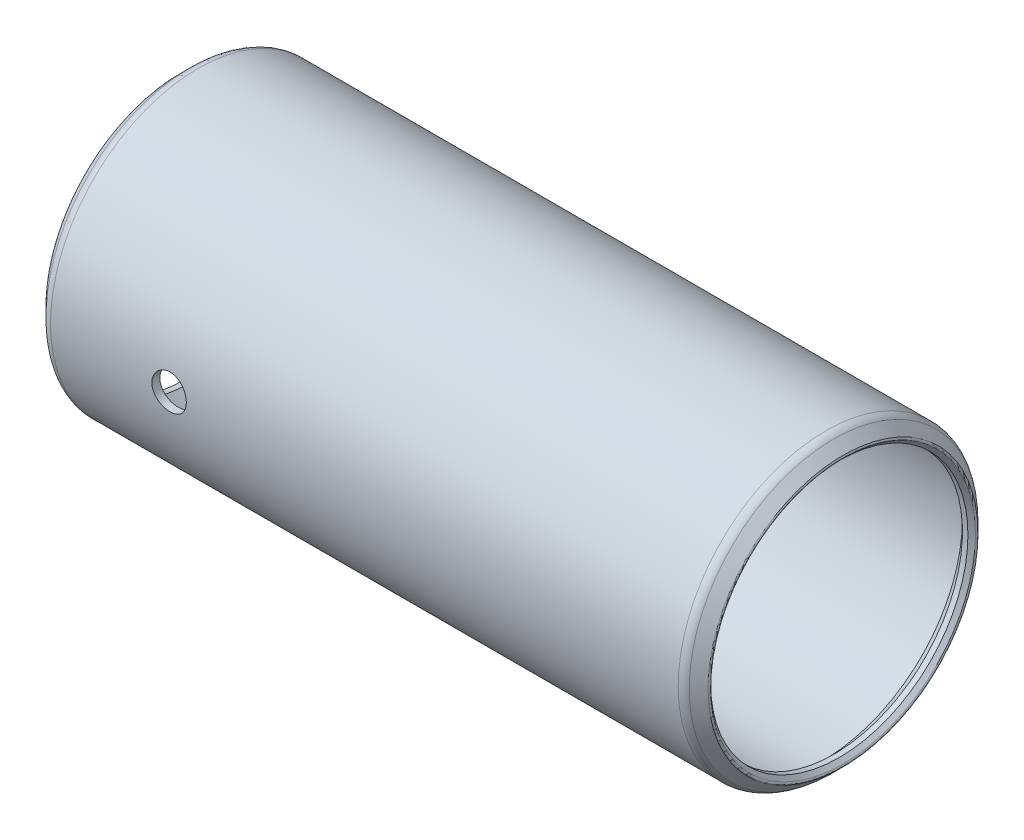
ISO-10303-21;
HEADER;
FILE_DESCRIPTION(('STEP AP214'),'2;1');
FILE_NAME('part.step','',(''),(''),'','','');
FILE_SCHEMA(('AUTOMOTIVE_DESIGN { 1 0 10303 214 1 1 1 1 }'));
ENDSEC;
DATA;
#1=APPLICATION_CONTEXT('core data for automotive mechanical design processes');
#2=APPLICATION_PROTOCOL_DEFINITION('international standard','automotive_design',2000,#1);
#3=PRODUCT_CONTEXT('',#1,'mechanical');
#4=PRODUCT('Part','Part','',(#3));
#5=PRODUCT_RELATED_PRODUCT_CATEGORY('part','',(#4));
#6=PRODUCT_DEFINITION_FORMATION('','',#4);
#7=PRODUCT_DEFINITION_CONTEXT('part definition',#1,'design');
#8=PRODUCT_DEFINITION('design','',#6,#7);
#9=PRODUCT_DEFINITION_SHAPE('','',#8);
#10=(LENGTH_UNIT() NAMED_UNIT(*) SI_UNIT(.MILLI.,.METRE.));
#11=(NAMED_UNIT(*) PLANE_ANGLE_UNIT() SI_UNIT($,.RADIAN.));
#12=(NAMED_UNIT(*) SI_UNIT($,.STERADIAN.) SOLID_ANGLE_UNIT());
#13=UNCERTAINTY_MEASURE_WITH_UNIT(LENGTH_MEASURE(1.E-05),#10,'distance_accuracy_value','');
#14=(GEOMETRIC_REPRESENTATION_CONTEXT(3) GLOBAL_UNCERTAINTY_ASSIGNED_CONTEXT((#13)) GLOBAL_UNIT_ASSIGNED_CONTEXT((#10,
#11,#12)) REPRESENTATION_CONTEXT('',''));
#15=CARTESIAN_POINT('',(0.,0.,0.));
#16=DIRECTION('',(0.,0.,1.));
#17=DIRECTION('',(1.,0.,0.));
#18=AXIS2_PLACEMENT_3D('',#15,#16,#17);
#19=CARTESIAN_POINT('',(-0.639512806053456,0.,0.));
#20=DIRECTION('',(-1.,0.,0.));
#21=DIRECTION('',(0.,0.,1.));
#22=AXIS2_PLACEMENT_3D('',#19,#20,#21);
#23=CONICAL_SURFACE('',#22,9.16756280605346,0.785398163397452);
#24=CARTESIAN_POINT('',(-0.639512806053464,0.,0.));
#25=DIRECTION('',(1.,0.,0.));
#26=DIRECTION('',(0.,0.,-1.));
#27=AXIS2_PLACEMENT_3D('',#24,#25,#26);
#28=CIRCLE('',#27,9.16756280605346);
#29=CARTESIAN_POINT('',(-0.639512806053464,0.,-9.16756280605346));
#30=VERTEX_POINT('',#29);
#31=EDGE_CURVE('E136',#30,#30,#28,.T.);
#32=ORIENTED_EDGE('',*,*,#31,.F.);
#33=EDGE_LOOP('',(#32));
#34=FACE_BOUND('',#33,.T.);
#35=CARTESIAN_POINT('',(-0.380999999999999,0.,0.));
#36=DIRECTION('',(-1.,0.,0.));
#37=DIRECTION('',(0.,0.,1.));
#38=AXIS2_PLACEMENT_3D('',#35,#36,#37);
#39=CIRCLE('',#38,8.90905);
#40=CARTESIAN_POINT('',(-0.380999999999999,0.,8.90905));
#41=VERTEX_POINT('',#40);
#42=EDGE_CURVE('E139',#41,#41,#39,.F.);
#43=ORIENTED_EDGE('',*,*,#42,.T.);
#44=EDGE_LOOP('',(#43));
#45=FACE_BOUND('',#44,.T.);
#46=ADVANCED_FACE('F15',(#34,#45),#23,.F.);
#47=CARTESIAN_POINT('',(45.2165128060534,0.,0.));
#48=DIRECTION('',(1.,0.,0.));
#49=DIRECTION('',(0.,0.,-1.));
#50=AXIS2_PLACEMENT_3D('',#47,#48,#49);
#51=CONICAL_SURFACE('',#50,9.16756280605341,0.785398163397432);
#52=CARTESIAN_POINT('',(44.958,0.,0.));
#53=DIRECTION('',(-1.,0.,0.));
#54=DIRECTION('',(0.,0.,1.));
#55=AXIS2_PLACEMENT_3D('',#52,#53,#54);
#56=CIRCLE('',#55,8.90905);
#57=CARTESIAN_POINT('',(44.958,0.,8.90905));
#58=VERTEX_POINT('',#57);
#59=EDGE_CURVE('E144',#58,#58,#56,.T.);
#60=ORIENTED_EDGE('',*,*,#59,.T.);
#61=EDGE_LOOP('',(#60));
#62=FACE_BOUND('',#61,.T.);
#63=CARTESIAN_POINT('',(45.2165128060534,0.,0.));
#64=DIRECTION('',(1.,0.,0.));
#65=DIRECTION('',(0.,0.,-1.));
#66=AXIS2_PLACEMENT_3D('',#63,#64,#65);
#67=CIRCLE('',#66,9.16756280605341);
#68=CARTESIAN_POINT('',(45.2165128060534,0.,-9.16756280605341));
#69=VERTEX_POINT('',#68);
#70=EDGE_CURVE('E112',#69,#69,#67,.F.);
#71=ORIENTED_EDGE('',*,*,#70,.F.);
#72=EDGE_LOOP('',(#71));
#73=FACE_BOUND('',#72,.T.);
#74=ADVANCED_FACE('F149',(#62,#73),#51,.F.);
#75=CARTESIAN_POINT('',(44.577,0.,0.));
#76=DIRECTION('',(-1.,0.,0.));
#77=DIRECTION('',(0.,0.,1.));
#78=AXIS2_PLACEMENT_3D('',#75,#76,#77);
#79=CYLINDRICAL_SURFACE('',#78,8.90905);
#80=CARTESIAN_POINT('',(44.577,0.,0.));
#81=DIRECTION('',(-1.,0.,0.));
#82=DIRECTION('',(0.,0.,1.));
#83=AXIS2_PLACEMENT_3D('',#80,#81,#82);
#84=CIRCLE('',#83,8.90905);
#85=CARTESIAN_POINT('',(44.577,0.,8.90905));
#86=VERTEX_POINT('',#85);
#87=EDGE_CURVE('E107',#86,#86,#84,.T.);
#88=ORIENTED_EDGE('',*,*,#87,.T.);
#89=EDGE_LOOP('',(#88));
#90=FACE_BOUND('',#89,.T.);
#91=ORIENTED_EDGE('',*,*,#59,.F.);
#92=EDGE_LOOP('',(#91));
#93=FACE_BOUND('',#92,.T.);
#94=ADVANCED_FACE('F152',(#90,#93),#79,.F.);
#95=CARTESIAN_POINT('',(44.577,0.,0.));
#96=DIRECTION('',(-1.,0.,0.));
#97=DIRECTION('',(0.,0.,1.));
#98=AXIS2_PLACEMENT_3D('',#95,#96,#97);
#99=CYLINDRICAL_SURFACE('',#98,8.90905);
#100=ORIENTED_EDGE('',*,*,#42,.F.);
#101=EDGE_LOOP('',(#100));
#102=FACE_BOUND('',#101,.T.);
#103=CARTESIAN_POINT('',(0.,0.,0.));
#104=DIRECTION('',(1.,0.,0.));
#105=DIRECTION('',(0.,0.,-1.));
#106=AXIS2_PLACEMENT_3D('',#103,#104,#105);
#107=CIRCLE('',#106,8.90905);
#108=CARTESIAN_POINT('',(0.,0.,-8.90905));
#109=VERTEX_POINT('',#108);
#110=EDGE_CURVE('E102',#109,#109,#107,.T.);
#111=ORIENTED_EDGE('',*,*,#110,.T.);
#112=EDGE_LOOP('',(#111));
#113=FACE_BOUND('',#112,.T.);
#114=ADVANCED_FACE('F130',(#102,#113),#99,.F.);
#115=CARTESIAN_POINT('',(-0.549710244842767,0.,0.));
#116=DIRECTION('',(1.,0.,0.));
#117=DIRECTION('',(0.,0.,-1.));
#118=AXIS2_PLACEMENT_3D('',#115,#116,#117);
#119=TOROIDAL_SURFACE('',#118,9.25736536726414,0.126999999999999);
#120=CARTESIAN_POINT('',(-0.639512806053453,0.,0.));
#121=DIRECTION('',(1.,0.,0.));
#122=DIRECTION('',(0.,0.,-1.));
#123=AXIS2_PLACEMENT_3D('',#120,#121,#122);
#124=CIRCLE('',#123,9.34716792847483);
#125=CARTESIAN_POINT('',(-0.639512806053452,0.,-9.34716792847483));
#126=VERTEX_POINT('',#125);
#127=EDGE_CURVE('E97',#126,#126,#124,.T.);
#128=ORIENTED_EDGE('',*,*,#127,.F.);
#129=EDGE_LOOP('',(#128));
#130=FACE_BOUND('',#129,.T.);
#131=ORIENTED_EDGE('',*,*,#31,.T.);
#132=EDGE_LOOP('',(#131));
#133=FACE_BOUND('',#132,.T.);
#134=ADVANCED_FACE('F124',(#130,#133),#119,.T.);
#135=CARTESIAN_POINT('',(45.1267102448427,0.,0.));
#136=DIRECTION('',(1.,0.,0.));
#137=DIRECTION('',(0.,0.,-1.));
#138=AXIS2_PLACEMENT_3D('',#135,#136,#137);
#139=TOROIDAL_SURFACE('',#138,9.25736536726414,0.12700000000001);
#140=ORIENTED_EDGE('',*,*,#70,.T.);
#141=EDGE_LOOP('',(#140));
#142=FACE_BOUND('',#141,.T.);
#143=CARTESIAN_POINT('',(45.2165128060534,0.,0.));
#144=DIRECTION('',(-1.,0.,0.));
#145=DIRECTION('',(0.,0.,1.));
#146=AXIS2_PLACEMENT_3D('',#143,#144,#145);
#147=CIRCLE('',#146,9.34716792847484);
#148=CARTESIAN_POINT('',(45.2165128060534,0.,9.34716792847484));
#149=VERTEX_POINT('',#148);
#150=EDGE_CURVE('E92',#149,#149,#147,.T.);
#151=ORIENTED_EDGE('',*,*,#150,.F.);
#152=EDGE_LOOP('',(#151));
#153=FACE_BOUND('',#152,.T.);
#154=ADVANCED_FACE('F119',(#142,#153),#139,.T.);
#155=CARTESIAN_POINT('',(43.815,0.,0.));
#156=DIRECTION('',(-1.,0.,0.));
#157=DIRECTION('',(0.,0.,1.));
#158=AXIS2_PLACEMENT_3D('',#155,#156,#157);
#159=CONICAL_SURFACE('',#158,9.67105,0.78539816339745);
#160=CARTESIAN_POINT('',(43.815,0.,0.));
#161=DIRECTION('',(-1.,0.,0.));
#162=DIRECTION('',(0.,0.,1.));
#163=AXIS2_PLACEMENT_3D('',#160,#161,#162);
#164=CIRCLE('',#163,9.67105);
#165=CARTESIAN_POINT('',(43.815,0.,9.67105));
#166=VERTEX_POINT('',#165);
#167=EDGE_CURVE('E87',#166,#166,#164,.T.);
#168=ORIENTED_EDGE('',*,*,#167,.T.);
#169=EDGE_LOOP('',(#168));
#170=FACE_BOUND('',#169,.T.);
#171=ORIENTED_EDGE('',*,*,#87,.F.);
#172=EDGE_LOOP('',(#171));
#173=FACE_BOUND('',#172,.T.);
#174=ADVANCED_FACE('F123',(#170,#173),#159,.F.);
#175=CARTESIAN_POINT('',(0.762,0.,0.));
#176=DIRECTION('',(1.,0.,0.));
#177=DIRECTION('',(0.,0.,-1.));
#178=AXIS2_PLACEMENT_3D('',#175,#176,#177);
#179=CONICAL_SURFACE('',#178,9.67105,0.785398163397448);
#180=ORIENTED_EDGE('',*,*,#110,.F.);
#181=EDGE_LOOP('',(#180));
#182=FACE_BOUND('',#181,.T.);
#183=CARTESIAN_POINT('',(0.761999999999999,0.,0.));
#184=DIRECTION('',(-1.,0.,0.));
#185=DIRECTION('',(0.,0.,1.));
#186=AXIS2_PLACEMENT_3D('',#183,#184,#185);
#187=CIRCLE('',#186,9.67105);
#188=CARTESIAN_POINT('',(0.761999999999999,0.,9.67105));
#189=VERTEX_POINT('',#188);
#190=EDGE_CURVE('E82',#189,#189,#187,.F.);
#191=ORIENTED_EDGE('',*,*,#190,.T.);
#192=EDGE_LOOP('',(#191));
#193=FACE_BOUND('',#192,.T.);
#194=ADVANCED_FACE('F163',(#182,#193),#179,.F.);
#195=CARTESIAN_POINT('',(0.013634632735857,0.,0.));
#196=DIRECTION('',(1.,0.,0.));
#197=DIRECTION('',(0.,1.,0.));
#198=AXIS2_PLACEMENT_3D('',#195,#196,#197);
#199=CONICAL_SURFACE('',#198,10.0003153672641,0.785398163397447);
#200=CARTESIAN_POINT('',(0.0136346327358494,0.,0.));
#201=DIRECTION('',(1.,0.,0.));
#202=DIRECTION('',(0.,0.,-1.));
#203=AXIS2_PLACEMENT_3D('',#200,#201,#202);
#204=CIRCLE('',#203,10.0003153672641);
#205=CARTESIAN_POINT('',(0.0136346327358494,0.,-10.0003153672641));
#206=VERTEX_POINT('',#205);
#207=EDGE_CURVE('E79',#206,#206,#204,.T.);
#208=ORIENTED_EDGE('',*,*,#207,.F.);
#209=EDGE_LOOP('',(#208));
#210=FACE_BOUND('',#209,.T.);
#211=ORIENTED_EDGE('',*,*,#127,.T.);
#212=EDGE_LOOP('',(#211));
#213=FACE_BOUND('',#212,.T.);
#214=ADVANCED_FACE('F168',(#210,#213),#199,.T.);
#215=CARTESIAN_POINT('',(44.5633653672641,0.,0.));
#216=DIRECTION('',(-1.,0.,0.));
#217=DIRECTION('',(0.,-1.,0.));
#218=AXIS2_PLACEMENT_3D('',#215,#216,#217);
#219=CONICAL_SURFACE('',#218,10.0003153672641,0.785398163397447);
#220=ORIENTED_EDGE('',*,*,#150,.T.);
#221=EDGE_LOOP('',(#220));
#222=FACE_BOUND('',#221,.T.);
#223=CARTESIAN_POINT('',(44.5633653672642,0.,0.));
#224=DIRECTION('',(1.,0.,0.));
#225=DIRECTION('',(0.,0.,-1.));
#226=AXIS2_PLACEMENT_3D('',#223,#224,#225);
#227=CIRCLE('',#226,10.0003153672641);
#228=CARTESIAN_POINT('',(44.5633653672642,0.,-10.0003153672641));
#229=VERTEX_POINT('',#228);
#230=EDGE_CURVE('E58',#229,#229,#227,.F.);
#231=ORIENTED_EDGE('',*,*,#230,.F.);
#232=EDGE_LOOP('',(#231));
#233=FACE_BOUND('',#232,.T.);
#234=ADVANCED_FACE('F173',(#222,#233),#219,.T.);
#235=CARTESIAN_POINT('',(44.577,0.,0.));
#236=DIRECTION('',(-1.,0.,0.));
#237=DIRECTION('',(0.,0.,1.));
#238=AXIS2_PLACEMENT_3D('',#235,#236,#237);
#239=CYLINDRICAL_SURFACE('',#238,9.67105);
#240=CARTESIAN_POINT('',(7.57499932623616,-0.117541672472774,9.67033701722398));
#241=CARTESIAN_POINT('',(7.58158854313117,-0.184113116031582,9.66952724776607));
#242=CARTESIAN_POINT('',(7.5937914631775,-0.250163463955482,9.66802944918942));
#243=CARTESIAN_POINT('',(7.62907848047445,-0.379301163106916,9.66382526538221));
#244=CARTESIAN_POINT('',(7.65217434105466,-0.442385229848643,9.66111757375003));
#245=CARTESIAN_POINT('',(7.70855830436448,-0.563721646811677,9.65479766108064));
#246=CARTESIAN_POINT('',(7.74183924989512,-0.621977353571383,9.65118607554576));
#247=CARTESIAN_POINT('',(7.81764381178295,-0.732070242021515,9.64346052700254));
#248=CARTESIAN_POINT('',(7.86016572248835,-0.783908605425708,9.63934665676475));
#249=CARTESIAN_POINT('',(7.95349690235225,-0.879982789610553,9.63105287043349));
#250=CARTESIAN_POINT('',(8.00434522391299,-0.924180663854123,9.62687273125568));
#251=CARTESIAN_POINT('',(8.11276559274869,-1.00342537190042,9.61893635505544));
#252=CARTESIAN_POINT('',(8.17033787267402,-1.03847188892841,9.61518013270946));
#253=CARTESIAN_POINT('',(8.29063690036858,-1.09843125062155,9.60851559389446));
#254=CARTESIAN_POINT('',(8.35336729530751,-1.12333684954758,9.60560788411092));
#255=CARTESIAN_POINT('',(8.48216397569071,-1.16224550388362,9.6009781145109));
#256=CARTESIAN_POINT('',(8.54823010522747,-1.17624906833798,9.59925599933635));
#257=CARTESIAN_POINT('',(8.68136457128116,-1.19288111653293,9.59720342851375));
#258=CARTESIAN_POINT('',(8.74842363721524,-1.1955827356608,9.59686402564868));
#259=CARTESIAN_POINT('',(8.88203976845853,-1.18973090344071,9.597591196177));
#260=CARTESIAN_POINT('',(8.94859684610853,-1.18117772969178,9.5986577348929));
#261=CARTESIAN_POINT('',(9.07907693648965,-1.15312242880594,9.60206816808755));
#262=CARTESIAN_POINT('',(9.14300847934612,-1.1336593698528,9.60440750382083));
#263=CARTESIAN_POINT('',(9.26669947110793,-1.08437895676159,9.61009583082664));
#264=CARTESIAN_POINT('',(9.32645877786876,-1.0545612500561,9.61344485647779));
#265=CARTESIAN_POINT('',(9.44043411658948,-0.985247244076201,9.62079580179556));
#266=CARTESIAN_POINT('',(9.49462132205795,-0.945703884124577,9.62480086345104));
#267=CARTESIAN_POINT('',(9.59561637584779,-0.858123764093473,9.6330037421642));
#268=CARTESIAN_POINT('',(9.64242394112626,-0.810086678390663,9.63720156660724));
#269=CARTESIAN_POINT('',(9.72760454269094,-0.706551991202835,9.64534597211571));
#270=CARTESIAN_POINT('',(9.76592768220346,-0.651013194979445,9.64929097472557));
#271=CARTESIAN_POINT('',(9.83270259713376,-0.534245209413172,9.65645933254044));
#272=CARTESIAN_POINT('',(9.86115453608433,-0.473016114360821,9.65968269970022));
#273=CARTESIAN_POINT('',(9.90730432415686,-0.346747294087756,9.66503774853834));
#274=CARTESIAN_POINT('',(9.92502721622616,-0.281716834189445,9.66717197057436));
#275=CARTESIAN_POINT('',(9.94929591821741,-0.14957450154383,9.670118951223));
#276=CARTESIAN_POINT('',(9.95584224402957,-0.0824627250119578,9.67093177082909));
#277=CARTESIAN_POINT('',(9.95755646929689,0.0514572027889127,9.67114338317607));
#278=CARTESIAN_POINT('',(9.95280022714426,0.118264380085298,9.67055160306997));
#279=CARTESIAN_POINT('',(9.9322091218143,0.250122171686788,9.66803996298382));
#280=CARTESIAN_POINT('',(9.91637429982445,0.315172792521412,9.66612010794125));
#281=CARTESIAN_POINT('',(9.87410571006115,0.441638971645314,9.66116807123172));
#282=CARTESIAN_POINT('',(9.84767891971315,0.503056892459059,9.65813662193561));
#283=CARTESIAN_POINT('',(9.78498464984786,0.620598911033191,9.65129708407713));
#284=CARTESIAN_POINT('',(9.74871675411091,0.67672278475185,9.64748896266789));
#285=CARTESIAN_POINT('',(9.66709630558121,0.782468956808014,9.63949089541932));
#286=CARTESIAN_POINT('',(9.62168725400926,0.832047478107128,9.63529866797039));
#287=CARTESIAN_POINT('',(9.52319822638314,0.922900829218191,9.62702177510442));
#288=CARTESIAN_POINT('',(9.4701180525749,0.964175444897888,9.6229371124635));
#289=CARTESIAN_POINT('',(9.35755701363187,1.03739289973168,9.61532051719901));
#290=CARTESIAN_POINT('',(9.29805371626546,1.06930148529984,9.6117906348541));
#291=CARTESIAN_POINT('',(9.17448323879576,1.12266145980967,9.60570480194136));
#292=CARTESIAN_POINT('',(9.11041622310196,1.14411322524367,9.60314881630962));
#293=CARTESIAN_POINT('',(8.97986460272842,1.1758482003326,9.59931486352368));
#294=CARTESIAN_POINT('',(8.91339319742235,1.18618495402066,9.59803077169392));
#295=CARTESIAN_POINT('',(8.77964717493471,1.19556467052604,9.5968670177106));
#296=CARTESIAN_POINT('',(8.71237258774658,1.19460805376505,9.59698730327585));
#297=CARTESIAN_POINT('',(8.57934116626729,1.18146935684314,9.59861345752158));
#298=CARTESIAN_POINT('',(8.51357780593259,1.16935220652066,9.6001113116985));
#299=CARTESIAN_POINT('',(8.38502592762168,1.13434214926068,9.60431069812691));
#300=CARTESIAN_POINT('',(8.32223746214292,1.11144905223981,9.60701225161111));
#301=CARTESIAN_POINT('',(8.20124554592243,1.05548275712086,9.61332174466498));
#302=CARTESIAN_POINT('',(8.14305324712492,1.02238569945185,9.61693180489106));
#303=CARTESIAN_POINT('',(8.03302785384644,0.946967678196052,9.62465024257177));
#304=CARTESIAN_POINT('',(7.9811948423907,0.904646594202761,9.628758626531));
#305=CARTESIAN_POINT('',(7.88499118649555,0.811643457365591,9.63704477999211));
#306=CARTESIAN_POINT('',(7.84067293004596,0.760907225302052,9.64122283006283));
#307=CARTESIAN_POINT('',(7.76116221520707,0.65267806454326,9.64915324289446));
#308=CARTESIAN_POINT('',(7.72597175093469,0.595183663394423,9.65290551253604));
#309=CARTESIAN_POINT('',(7.6657018946921,0.474996126285035,9.65956578524802));
#310=CARTESIAN_POINT('',(7.64063393577493,0.412297207769188,9.66247283263496));
#311=CARTESIAN_POINT('',(7.60142451356107,0.283579770681972,9.66710521945917));
#312=CARTESIAN_POINT('',(7.58727102250661,0.217564991923325,9.66883185946801));
#313=CARTESIAN_POINT('',(7.57310215457929,0.106380626080462,9.67056771647085));
#314=CARTESIAN_POINT('',(7.56994773113298,0.0615924612103977,9.67095743269417));
#315=CARTESIAN_POINT('',(7.56868781222915,-0.0280557474469998,9.67111349310709));
#316=CARTESIAN_POINT('',(7.57058227293182,-0.072915790606828,9.67087984270944));
#317=CARTESIAN_POINT('',(7.57499932623616,-0.117541672472774,9.67033701722398));
#318=B_SPLINE_CURVE_WITH_KNOTS('',3,(#240,#241,#242,#243,#244,#245,#246,#247,#248,#249,#250,
#251,#252,#253,#254,#255,#256,#257,#258,#259,#260,#261,#262,#263,#264,#265,#266,#267,#268,#269,
#270,#271,#272,#273,#274,#275,#276,#277,#278,#279,#280,#281,#282,#283,#284,#285,#286,#287,#288,
#289,#290,#291,#292,#293,#294,#295,#296,#297,#298,#299,#300,#301,#302,#303,#304,#305,#306,#307,
#308,#309,#310,#311,#312,#313,#314,#315,#316,#317),.UNSPECIFIED.,.T.,.F.,(4,2,2,2,2,2,2,2,2,2,2,
2,2,2,2,2,2,2,2,2,2,2,2,2,2,2,2,2,2,2,2,2,2,2,2,2,2,2,4),(0.,0.200540949083478,0.4012989607377,
0.601916219664815,0.802496481048937,1.00404596401342,1.20560242269975,1.40730264288112,
1.60899344458991,1.8093770578346,2.00975572871772,2.20942138804603,2.40909384649599,
2.60975217812385,2.81041820404374,3.01223471944609,3.21404789126395,3.41538817100177,
3.61671915698292,3.81670270893465,4.01668551739977,4.21653680377882,4.41639654398489,
4.6175317354241,4.81867211285825,5.02053919142823,5.22239900134287,5.42328198024583,
5.62415748084131,5.82387165823419,6.02358935863678,6.22377764006907,6.42396853483039,
6.62550226319736,6.82707998292201,7.0288847457918,7.23046680048394,7.36489973347498,
7.49933149917912),.UNSPECIFIED.);
#319=CARTESIAN_POINT('',(7.57499932623616,-0.117541672472774,9.67033701722398));
#320=VERTEX_POINT('',#319);
#321=EDGE_CURVE('E18',#320,#320,#318,.T.);
#322=ORIENTED_EDGE('',*,*,#321,.T.);
#323=EDGE_LOOP('',(#322));
#324=FACE_BOUND('',#323,.T.);
#325=ORIENTED_EDGE('',*,*,#190,.F.);
#326=EDGE_LOOP('',(#325));
#327=FACE_BOUND('',#326,.T.);
#328=ORIENTED_EDGE('',*,*,#167,.F.);
#329=EDGE_LOOP('',(#328));
#330=FACE_BOUND('',#329,.T.);
#331=ADVANCED_FACE('F73',(#324,#327,#330),#239,.F.);
#332=CARTESIAN_POINT('',(0.552450000000005,0.,0.));
#333=DIRECTION('',(1.,0.,0.));
#334=DIRECTION('',(0.,0.,-1.));
#335=AXIS2_PLACEMENT_3D('',#332,#333,#334);
#336=TOROIDAL_SURFACE('',#335,9.4615,0.762000000000002);
#337=CARTESIAN_POINT('',(0.552450000000003,0.,0.));
#338=DIRECTION('',(-1.,0.,0.));
#339=DIRECTION('',(0.,0.,1.));
#340=AXIS2_PLACEMENT_3D('',#337,#338,#339);
#341=CIRCLE('',#340,10.2235);
#342=CARTESIAN_POINT('',(0.552450000000003,0.,10.2235));
#343=VERTEX_POINT('',#342);
#344=EDGE_CURVE('E30',#343,#343,#341,.F.);
#345=ORIENTED_EDGE('',*,*,#344,.F.);
#346=EDGE_LOOP('',(#345));
#347=FACE_BOUND('',#346,.T.);
#348=ORIENTED_EDGE('',*,*,#207,.T.);
#349=EDGE_LOOP('',(#348));
#350=FACE_BOUND('',#349,.T.);
#351=ADVANCED_FACE('F69',(#347,#350),#336,.T.);
#352=CARTESIAN_POINT('',(44.02455,0.,0.));
#353=DIRECTION('',(1.,0.,0.));
#354=DIRECTION('',(0.,0.,-1.));
#355=AXIS2_PLACEMENT_3D('',#352,#353,#354);
#356=TOROIDAL_SURFACE('',#355,9.46150000000003,0.761999999999982);
#357=ORIENTED_EDGE('',*,*,#230,.T.);
#358=EDGE_LOOP('',(#357));
#359=FACE_BOUND('',#358,.T.);
#360=CARTESIAN_POINT('',(44.02455,0.,0.));
#361=DIRECTION('',(-1.,0.,0.));
#362=DIRECTION('',(0.,0.,1.));
#363=AXIS2_PLACEMENT_3D('',#360,#361,#362);
#364=CIRCLE('',#363,10.2235);
#365=CARTESIAN_POINT('',(44.02455,0.,10.2235));
#366=VERTEX_POINT('',#365);
#367=EDGE_CURVE('E26',#366,#366,#364,.T.);
#368=ORIENTED_EDGE('',*,*,#367,.F.);
#369=EDGE_LOOP('',(#368));
#370=FACE_BOUND('',#369,.T.);
#371=ADVANCED_FACE('F48',(#359,#370),#356,.T.);
#372=CARTESIAN_POINT('',(8.763,0.,10.2235));
#373=DIRECTION('',(0.,0.,1.));
#374=DIRECTION('',(1.,0.,0.));
#375=AXIS2_PLACEMENT_3D('',#372,#373,#374);
#376=CYLINDRICAL_SURFACE('',#375,1.1938);
#377=CARTESIAN_POINT('',(7.57503255959518,0.117865098221926,10.2228207129968));
#378=CARTESIAN_POINT('',(7.58164185399756,0.184451738238068,10.2220521892874));
#379=CARTESIAN_POINT('',(7.59386641275454,0.250517108341546,10.2206337606903));
#380=CARTESIAN_POINT('',(7.62920491154565,0.379683883444172,10.2166521583949));
#381=CARTESIAN_POINT('',(7.65233075420195,0.442781965574189,10.2140877335943));
#382=CARTESIAN_POINT('',(7.70878303387938,0.564144771430752,10.2081038125035));
#383=CARTESIAN_POINT('',(7.74210254922888,0.622412740866677,10.2046848967143));
#384=CARTESIAN_POINT('',(7.81799186262829,0.732522304931157,10.1973728431257));
#385=CARTESIAN_POINT('',(7.86055989792924,0.784365121227709,10.1934797957568));
#386=CARTESIAN_POINT('',(7.95396444018959,0.880412611602642,10.1856351061752));
#387=CARTESIAN_POINT('',(8.00483599849146,0.924583192448747,10.1816832830893));
#388=CARTESIAN_POINT('',(8.11329560022432,1.00376851942105,10.1741824239074));
#389=CARTESIAN_POINT('',(8.17088387598666,1.03878294869996,10.1706334017527));
#390=CARTESIAN_POINT('',(8.29119902289641,1.09867211827954,10.1643388097486));
#391=CARTESIAN_POINT('',(8.35392905989606,1.12354055437358,10.1615937397323));
#392=CARTESIAN_POINT('',(8.48271394384977,1.16237735573421,10.1572248360335));
#393=CARTESIAN_POINT('',(8.54876865195897,1.17634617578904,10.1556009555694));
#394=CARTESIAN_POINT('',(8.68191772821593,1.19292033032302,10.1536675002804));
#395=CARTESIAN_POINT('',(8.74900384304383,1.19559111062029,10.1533503562412));
#396=CARTESIAN_POINT('',(8.88266884867528,1.18966926137935,10.1540458817565));
#397=CARTESIAN_POINT('',(8.94924775075336,1.18107688294241,10.1550585216648));
#398=CARTESIAN_POINT('',(9.07979214452802,1.15292925816544,10.1582923676352));
#399=CARTESIAN_POINT('',(9.14376525149848,1.13340884949372,10.1605097324735));
#400=CARTESIAN_POINT('',(9.26752891918796,1.0839968399032,10.1658997147007));
#401=CARTESIAN_POINT('',(9.32731935130648,1.05410492027022,10.169072361445));
#402=CARTESIAN_POINT('',(9.44131190684333,0.98464504069237,10.176032887206));
#403=CARTESIAN_POINT('',(9.49548813847271,0.945034860665777,10.179823425811));
#404=CARTESIAN_POINT('',(9.59644720397913,0.857319228651974,10.1875850676469));
#405=CARTESIAN_POINT('',(9.64322978489807,0.809213486126266,10.1915561770498));
#406=CARTESIAN_POINT('',(9.72831754754031,0.705576571263385,10.1992559720031));
#407=CARTESIAN_POINT('',(9.7665781142797,0.650008653924146,10.2029833127387));
#408=CARTESIAN_POINT('',(9.83322413803512,0.533197996792912,10.209753667475));
#409=CARTESIAN_POINT('',(9.86160974250075,0.471955341751477,10.2127966916934));
#410=CARTESIAN_POINT('',(9.90763256819601,0.345661754708289,10.2178496836977));
#411=CARTESIAN_POINT('',(9.92529239588388,0.280619151395198,10.2198618228435));
#412=CARTESIAN_POINT('',(9.9494347654837,0.148466482817061,10.2226354443443));
#413=CARTESIAN_POINT('',(9.95591776877816,0.0813565030103222,10.2233969783245));
#414=CARTESIAN_POINT('',(9.95750904048402,-0.0525962927456068,10.2235827988226));
#415=CARTESIAN_POINT('',(9.95268522503953,-0.119438300423743,10.2230150697857));
#416=CARTESIAN_POINT('',(9.93194703698227,-0.251354920321053,10.2206226052374));
#417=CARTESIAN_POINT('',(9.9160326996938,-0.316429538168836,10.2187978737298));
#418=CARTESIAN_POINT('',(9.87359181933526,-0.442937170339135,10.2140964684673));
#419=CARTESIAN_POINT('',(9.84707128535245,-0.504372224116561,10.2112203904465));
#420=CARTESIAN_POINT('',(9.78417796657557,-0.621931175188777,10.2047353710242));
#421=CARTESIAN_POINT('',(9.74780480667212,-0.678054870159601,10.2011264017213));
#422=CARTESIAN_POINT('',(9.66599257686831,-0.783743660140316,10.1935531545696));
#423=CARTESIAN_POINT('',(9.62050279109809,-0.833269362940444,10.1895869606591));
#424=CARTESIAN_POINT('',(9.52186105023317,-0.924001729533378,10.1817607441617));
#425=CARTESIAN_POINT('',(9.46870892053424,-0.965208203701956,10.1779007239965));
#426=CARTESIAN_POINT('',(9.3560412082426,-1.03825926724972,10.1707092319297));
#427=CARTESIAN_POINT('',(9.29650579165096,-1.07007345230795,10.1673794923078));
#428=CARTESIAN_POINT('',(9.17289285603344,-1.12324201783563,10.1616435106408));
#429=CARTESIAN_POINT('',(9.10881548407566,-1.14459673680466,10.1592372387101));
#430=CARTESIAN_POINT('',(8.9782326142564,-1.17614859123131,10.1556329332914));
#431=CARTESIAN_POINT('',(8.91173890726794,-1.18639391696184,10.1544296831282));
#432=CARTESIAN_POINT('',(8.77796533168625,-1.1955873344691,10.1533514444899));
#433=CARTESIAN_POINT('',(8.71068548908642,-1.19453579872423,10.1534764122208));
#434=CARTESIAN_POINT('',(8.57761575842132,-1.18120265049948,10.1550359862161));
#435=CARTESIAN_POINT('',(8.51181998189902,-1.16897889545576,10.1564638451512));
#436=CARTESIAN_POINT('',(8.38322078354584,-1.13374214807881,10.1604572995966));
#437=CARTESIAN_POINT('',(8.32041741031265,-1.11072898058745,10.1630229135774));
#438=CARTESIAN_POINT('',(8.19942946461503,-1.05451688767821,10.169008940514));
#439=CARTESIAN_POINT('',(8.14125507443351,-1.02129624859407,10.1724311727915));
#440=CARTESIAN_POINT('',(8.03128856496177,-0.945627654342335,10.1797436339837));
#441=CARTESIAN_POINT('',(7.97949649353205,-0.903179629985924,10.1836338664074));
#442=CARTESIAN_POINT('',(7.88343644271908,-0.809958385736912,10.1914726893054));
#443=CARTESIAN_POINT('',(7.83921532596452,-0.759136883339327,10.1954214896685));
#444=CARTESIAN_POINT('',(7.7599130918995,-0.650756611171643,10.2029120043174));
#445=CARTESIAN_POINT('',(7.72483400070714,-0.59319635200177,10.206453628265));
#446=CARTESIAN_POINT('',(7.66480094548788,-0.472907829043321,10.2127341830854));
#447=CARTESIAN_POINT('',(7.63985731720824,-0.410174367832737,10.2154722937808));
#448=CARTESIAN_POINT('',(7.6008991306567,-0.281414877176102,10.2198283731811));
#449=CARTESIAN_POINT('',(7.58687242019582,-0.21539259607885,10.2214475871623));
#450=CARTESIAN_POINT('',(7.57294793672164,-0.104509994281785,10.2230618657847));
#451=CARTESIAN_POINT('',(7.56987933585573,-0.0600280705536841,10.2234206469597));
#452=CARTESIAN_POINT('',(7.56872226935736,0.0290012342946858,10.2235558125421));
#453=CARTESIAN_POINT('',(7.57063376901635,0.0735486149565932,10.2233322010085));
#454=CARTESIAN_POINT('',(7.57503255959518,0.117865098221926,10.2228207129968));
#455=B_SPLINE_CURVE_WITH_KNOTS('',3,(#377,#378,#379,#380,#381,#382,#383,#384,#385,#386,#387,
#388,#389,#390,#391,#392,#393,#394,#395,#396,#397,#398,#399,#400,#401,#402,#403,#404,#405,#406,
#407,#408,#409,#410,#411,#412,#413,#414,#415,#416,#417,#418,#419,#420,#421,#422,#423,#424,#425,
#426,#427,#428,#429,#430,#431,#432,#433,#434,#435,#436,#437,#438,#439,#440,#441,#442,#443,#444,
#445,#446,#447,#448,#449,#450,#451,#452,#453,#454),.UNSPECIFIED.,.T.,.F.,(4,2,2,2,2,2,2,2,2,2,2,
2,2,2,2,2,2,2,2,2,2,2,2,2,2,2,2,2,2,2,2,2,2,2,2,2,2,2,4),(0.,0.200591839524335,
0.401403205368953,0.6020785184902,0.802715616809552,1.00422266657815,1.20573668854641,
1.40737573113322,1.60900635984867,1.80946739568265,2.00992396250712,2.20974509960714,
2.4095723777095,2.61028365596383,2.81100179964345,3.01274726888096,3.21448972559397,
3.41580548556743,3.61711293496968,3.81721430162098,4.01731503093435,4.21730255066076,
4.41729768538679,4.61843792378325,4.81958274634962,5.02137174087445,5.22315420447257,
5.42405783167672,5.62495483473737,5.82481731381821,6.02468303763084,6.22497690078984,
6.42527226584494,6.62676580185137,6.82830395632693,7.03004711880765,7.23156538800862,
7.36506944907313,7.49857257969044),.UNSPECIFIED.);
#456=CARTESIAN_POINT('',(7.57503255959518,0.117865098221926,10.2228207129968));
#457=VERTEX_POINT('',#456);
#458=EDGE_CURVE('E10',#457,#457,#455,.T.);
#459=ORIENTED_EDGE('',*,*,#458,.F.);
#460=EDGE_LOOP('',(#459));
#461=FACE_BOUND('',#460,.T.);
#462=ORIENTED_EDGE('',*,*,#321,.F.);
#463=EDGE_LOOP('',(#462));
#464=FACE_BOUND('',#463,.T.);
#465=ADVANCED_FACE('F38',(#461,#464),#376,.F.);
#466=CARTESIAN_POINT('',(44.577,0.,0.));
#467=DIRECTION('',(-1.,0.,0.));
#468=DIRECTION('',(0.,0.,1.));
#469=AXIS2_PLACEMENT_3D('',#466,#467,#468);
#470=CYLINDRICAL_SURFACE('',#469,10.2235);
#471=ORIENTED_EDGE('',*,*,#458,.T.);
#472=EDGE_LOOP('',(#471));
#473=FACE_BOUND('',#472,.T.);
#474=ORIENTED_EDGE('',*,*,#367,.T.);
#475=EDGE_LOOP('',(#474));
#476=FACE_BOUND('',#475,.T.);
#477=ORIENTED_EDGE('',*,*,#344,.T.);
#478=EDGE_LOOP('',(#477));
#479=FACE_BOUND('',#478,.T.);
#480=ADVANCED_FACE('F41',(#473,#476,#479),#470,.T.);
#481=CLOSED_SHELL('',(#46,#74,#94,#114,#134,#154,#174,#194,#214,#234,#331,#351,#371,#465,#480));
#482=MANIFOLD_SOLID_BREP('B1',#481);
#483=ADVANCED_BREP_SHAPE_REPRESENTATION('',(#18,#482),#14);
#484=SHAPE_DEFINITION_REPRESENTATION(#9,#483);
ENDSEC;
END-ISO-10303-21;
